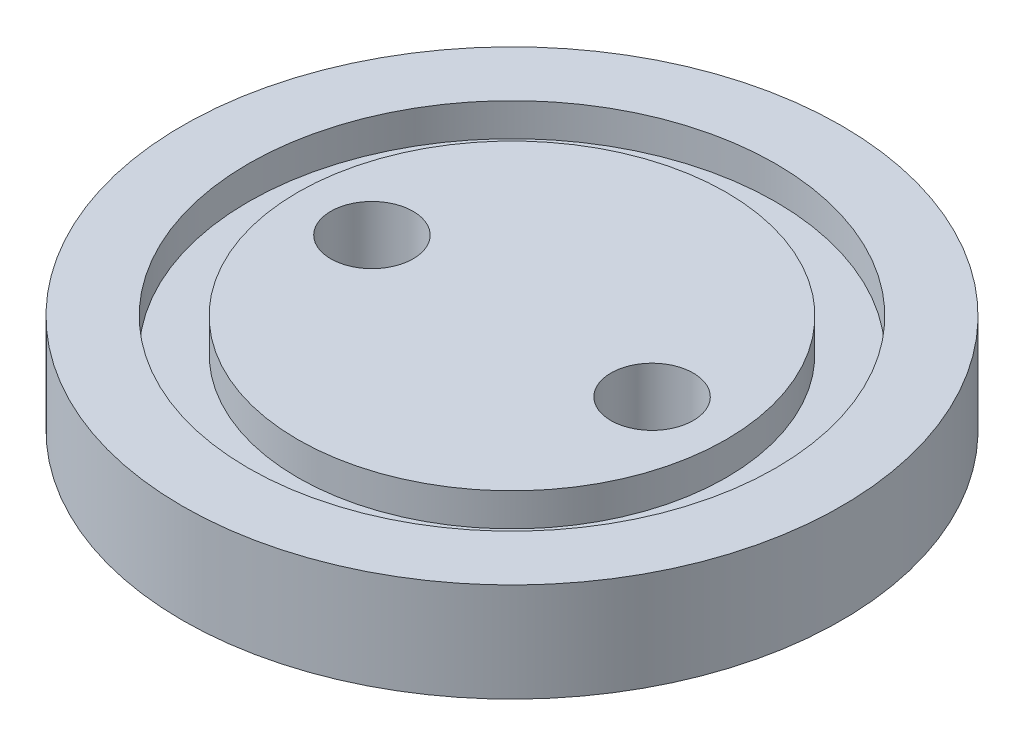
ISO-10303-21;
HEADER;
FILE_DESCRIPTION(('STEP AP214'),'2;1');
FILE_NAME('part.step','',(''),(''),'','','');
FILE_SCHEMA(('AUTOMOTIVE_DESIGN { 1 0 10303 214 1 1 1 1 }'));
ENDSEC;
DATA;
#1=APPLICATION_CONTEXT('core data for automotive mechanical design processes');
#2=APPLICATION_PROTOCOL_DEFINITION('international standard','automotive_design',2000,#1);
#3=PRODUCT_CONTEXT('',#1,'mechanical');
#4=PRODUCT('Part','Part','',(#3));
#5=PRODUCT_RELATED_PRODUCT_CATEGORY('part','',(#4));
#6=PRODUCT_DEFINITION_FORMATION('','',#4);
#7=PRODUCT_DEFINITION_CONTEXT('part definition',#1,'design');
#8=PRODUCT_DEFINITION('design','',#6,#7);
#9=PRODUCT_DEFINITION_SHAPE('','',#8);
#10=(LENGTH_UNIT() NAMED_UNIT(*) SI_UNIT(.MILLI.,.METRE.));
#11=(NAMED_UNIT(*) PLANE_ANGLE_UNIT() SI_UNIT($,.RADIAN.));
#12=(NAMED_UNIT(*) SI_UNIT($,.STERADIAN.) SOLID_ANGLE_UNIT());
#13=UNCERTAINTY_MEASURE_WITH_UNIT(LENGTH_MEASURE(1.E-05),#10,'distance_accuracy_value','');
#14=(GEOMETRIC_REPRESENTATION_CONTEXT(3) GLOBAL_UNCERTAINTY_ASSIGNED_CONTEXT((#13)) GLOBAL_UNIT_ASSIGNED_CONTEXT((#10,
#11,#12)) REPRESENTATION_CONTEXT('',''));
#15=CARTESIAN_POINT('',(0.,0.,0.));
#16=DIRECTION('',(0.,0.,1.));
#17=DIRECTION('',(1.,0.,0.));
#18=AXIS2_PLACEMENT_3D('',#15,#16,#17);
#19=CARTESIAN_POINT('',(0.,3.,0.));
#20=DIRECTION('',(0.,-1.,0.));
#21=DIRECTION('',(0.,0.,-1.));
#22=AXIS2_PLACEMENT_3D('',#19,#20,#21);
#23=CYLINDRICAL_SURFACE('',#22,10.);
#24=CARTESIAN_POINT('',(0.,3.,0.));
#25=DIRECTION('',(0.,1.,0.));
#26=DIRECTION('',(0.,0.,1.));
#27=AXIS2_PLACEMENT_3D('',#24,#25,#26);
#28=CIRCLE('',#27,10.);
#29=CARTESIAN_POINT('',(0.,3.,10.));
#30=VERTEX_POINT('',#29);
#31=EDGE_CURVE('E10',#30,#30,#28,.T.);
#32=ORIENTED_EDGE('',*,*,#31,.F.);
#33=EDGE_LOOP('',(#32));
#34=FACE_BOUND('',#33,.T.);
#35=CARTESIAN_POINT('',(0.,0.,0.));
#36=DIRECTION('',(0.,1.,0.));
#37=DIRECTION('',(0.,0.,1.));
#38=AXIS2_PLACEMENT_3D('',#35,#36,#37);
#39=CIRCLE('',#38,10.);
#40=CARTESIAN_POINT('',(0.,0.,10.));
#41=VERTEX_POINT('',#40);
#42=EDGE_CURVE('E45',#41,#41,#39,.T.);
#43=ORIENTED_EDGE('',*,*,#42,.T.);
#44=EDGE_LOOP('',(#43));
#45=FACE_BOUND('',#44,.T.);
#46=ADVANCED_FACE('F42',(#34,#45),#23,.T.);
#47=CARTESIAN_POINT('',(0.,3.,0.));
#48=DIRECTION('',(0.,1.,0.));
#49=DIRECTION('',(0.,0.,1.));
#50=AXIS2_PLACEMENT_3D('',#47,#48,#49);
#51=PLANE('',#50);
#52=CARTESIAN_POINT('',(0.,3.,0.));
#53=DIRECTION('',(0.,1.,0.));
#54=DIRECTION('',(0.,0.,1.));
#55=AXIS2_PLACEMENT_3D('',#52,#53,#54);
#56=CIRCLE('',#55,8.);
#57=CARTESIAN_POINT('',(0.,3.,8.));
#58=VERTEX_POINT('',#57);
#59=EDGE_CURVE('E56',#58,#58,#56,.T.);
#60=ORIENTED_EDGE('',*,*,#59,.F.);
#61=EDGE_LOOP('',(#60));
#62=FACE_BOUND('',#61,.T.);
#63=ORIENTED_EDGE('',*,*,#31,.T.);
#64=EDGE_LOOP('',(#63));
#65=FACE_BOUND('',#64,.T.);
#66=ADVANCED_FACE('F97',(#62,#65),#51,.T.);
#67=CARTESIAN_POINT('',(0.,0.,0.));
#68=DIRECTION('',(0.,1.,0.));
#69=DIRECTION('',(0.,0.,1.));
#70=AXIS2_PLACEMENT_3D('',#67,#68,#69);
#71=PLANE('',#70);
#72=CARTESIAN_POINT('',(4.25,0.,0.));
#73=DIRECTION('',(0.,1.,0.));
#74=DIRECTION('',(0.,0.,1.));
#75=AXIS2_PLACEMENT_3D('',#72,#73,#74);
#76=CIRCLE('',#75,1.25);
#77=CARTESIAN_POINT('',(4.25,0.,1.25));
#78=VERTEX_POINT('',#77);
#79=EDGE_CURVE('E80',#78,#78,#76,.T.);
#80=ORIENTED_EDGE('',*,*,#79,.T.);
#81=EDGE_LOOP('',(#80));
#82=FACE_BOUND('',#81,.T.);
#83=CARTESIAN_POINT('',(-4.25,0.,0.));
#84=DIRECTION('',(0.,1.,0.));
#85=DIRECTION('',(0.,0.,-1.));
#86=AXIS2_PLACEMENT_3D('',#83,#84,#85);
#87=CIRCLE('',#86,1.25);
#88=CARTESIAN_POINT('',(-4.25,0.,-1.25));
#89=VERTEX_POINT('',#88);
#90=EDGE_CURVE('E76',#89,#89,#87,.T.);
#91=ORIENTED_EDGE('',*,*,#90,.T.);
#92=EDGE_LOOP('',(#91));
#93=FACE_BOUND('',#92,.T.);
#94=ORIENTED_EDGE('',*,*,#42,.F.);
#95=EDGE_LOOP('',(#94));
#96=FACE_BOUND('',#95,.T.);
#97=ADVANCED_FACE('F119',(#82,#93,#96),#71,.F.);
#98=CARTESIAN_POINT('',(0.,2.,0.));
#99=DIRECTION('',(0.,1.,0.));
#100=DIRECTION('',(0.,0.,1.));
#101=AXIS2_PLACEMENT_3D('',#98,#99,#100);
#102=CYLINDRICAL_SURFACE('',#101,8.);
#103=CARTESIAN_POINT('',(0.,2.,0.));
#104=DIRECTION('',(0.,1.,0.));
#105=DIRECTION('',(0.,0.,1.));
#106=AXIS2_PLACEMENT_3D('',#103,#104,#105);
#107=CIRCLE('',#106,8.);
#108=CARTESIAN_POINT('',(0.,2.,8.));
#109=VERTEX_POINT('',#108);
#110=EDGE_CURVE('E54',#109,#109,#107,.T.);
#111=ORIENTED_EDGE('',*,*,#110,.F.);
#112=EDGE_LOOP('',(#111));
#113=FACE_BOUND('',#112,.T.);
#114=ORIENTED_EDGE('',*,*,#59,.T.);
#115=EDGE_LOOP('',(#114));
#116=FACE_BOUND('',#115,.T.);
#117=ADVANCED_FACE('F110',(#113,#116),#102,.F.);
#118=CARTESIAN_POINT('',(0.,2.,0.));
#119=DIRECTION('',(0.,1.,0.));
#120=DIRECTION('',(0.,0.,1.));
#121=AXIS2_PLACEMENT_3D('',#118,#119,#120);
#122=PLANE('',#121);
#123=CARTESIAN_POINT('',(0.,2.,0.));
#124=DIRECTION('',(0.,1.,0.));
#125=DIRECTION('',(0.,0.,1.));
#126=AXIS2_PLACEMENT_3D('',#123,#124,#125);
#127=CIRCLE('',#126,6.5);
#128=CARTESIAN_POINT('',(0.,2.,6.5));
#129=VERTEX_POINT('',#128);
#130=EDGE_CURVE('E60',#129,#129,#127,.T.);
#131=ORIENTED_EDGE('',*,*,#130,.F.);
#132=EDGE_LOOP('',(#131));
#133=FACE_BOUND('',#132,.T.);
#134=ORIENTED_EDGE('',*,*,#110,.T.);
#135=EDGE_LOOP('',(#134));
#136=FACE_BOUND('',#135,.T.);
#137=ADVANCED_FACE('F103',(#133,#136),#122,.T.);
#138=CARTESIAN_POINT('',(0.,2.,0.));
#139=DIRECTION('',(0.,1.,0.));
#140=DIRECTION('',(0.,0.,1.));
#141=AXIS2_PLACEMENT_3D('',#138,#139,#140);
#142=CYLINDRICAL_SURFACE('',#141,6.5);
#143=ORIENTED_EDGE('',*,*,#130,.T.);
#144=EDGE_LOOP('',(#143));
#145=FACE_BOUND('',#144,.T.);
#146=CARTESIAN_POINT('',(0.,3.,0.));
#147=DIRECTION('',(0.,1.,0.));
#148=DIRECTION('',(0.,0.,1.));
#149=AXIS2_PLACEMENT_3D('',#146,#147,#148);
#150=CIRCLE('',#149,6.5);
#151=CARTESIAN_POINT('',(0.,3.,6.5));
#152=VERTEX_POINT('',#151);
#153=EDGE_CURVE('E64',#152,#152,#150,.T.);
#154=ORIENTED_EDGE('',*,*,#153,.F.);
#155=EDGE_LOOP('',(#154));
#156=FACE_BOUND('',#155,.T.);
#157=ADVANCED_FACE('F95',(#145,#156),#142,.T.);
#158=CARTESIAN_POINT('',(4.25,3.,0.));
#159=DIRECTION('',(0.,1.,0.));
#160=DIRECTION('',(0.,0.,1.));
#161=AXIS2_PLACEMENT_3D('',#158,#159,#160);
#162=CIRCLE('',#161,1.25);
#163=CARTESIAN_POINT('',(4.25,3.,1.25));
#164=VERTEX_POINT('',#163);
#165=EDGE_CURVE('E68',#164,#164,#162,.T.);
#166=ORIENTED_EDGE('',*,*,#165,.F.);
#167=EDGE_LOOP('',(#166));
#168=FACE_BOUND('',#167,.T.);
#169=CARTESIAN_POINT('',(-4.25,3.,0.));
#170=DIRECTION('',(0.,1.,0.));
#171=DIRECTION('',(0.,0.,-1.));
#172=AXIS2_PLACEMENT_3D('',#169,#170,#171);
#173=CIRCLE('',#172,1.25);
#174=CARTESIAN_POINT('',(-4.25,3.,-1.25));
#175=VERTEX_POINT('',#174);
#176=EDGE_CURVE('E72',#175,#175,#173,.T.);
#177=ORIENTED_EDGE('',*,*,#176,.F.);
#178=EDGE_LOOP('',(#177));
#179=FACE_BOUND('',#178,.T.);
#180=ORIENTED_EDGE('',*,*,#153,.T.);
#181=EDGE_LOOP('',(#180));
#182=FACE_BOUND('',#181,.T.);
#183=ADVANCED_FACE('F91',(#168,#179,#182),#51,.T.);
#184=CARTESIAN_POINT('',(-4.25,3.,0.));
#185=DIRECTION('',(0.,-1.,0.));
#186=DIRECTION('',(0.,0.,-1.));
#187=AXIS2_PLACEMENT_3D('',#184,#185,#186);
#188=CYLINDRICAL_SURFACE('',#187,1.25);
#189=ORIENTED_EDGE('',*,*,#176,.T.);
#190=EDGE_LOOP('',(#189));
#191=FACE_BOUND('',#190,.T.);
#192=ORIENTED_EDGE('',*,*,#90,.F.);
#193=EDGE_LOOP('',(#192));
#194=FACE_BOUND('',#193,.T.);
#195=ADVANCED_FACE('F94',(#191,#194),#188,.F.);
#196=CARTESIAN_POINT('',(4.25,3.,0.));
#197=DIRECTION('',(0.,-1.,0.));
#198=DIRECTION('',(0.,0.,-1.));
#199=AXIS2_PLACEMENT_3D('',#196,#197,#198);
#200=CYLINDRICAL_SURFACE('',#199,1.25);
#201=ORIENTED_EDGE('',*,*,#165,.T.);
#202=EDGE_LOOP('',(#201));
#203=FACE_BOUND('',#202,.T.);
#204=ORIENTED_EDGE('',*,*,#79,.F.);
#205=EDGE_LOOP('',(#204));
#206=FACE_BOUND('',#205,.T.);
#207=ADVANCED_FACE('F88',(#203,#206),#200,.F.);
#208=CLOSED_SHELL('',(#46,#66,#97,#117,#137,#157,#183,#195,#207));
#209=MANIFOLD_SOLID_BREP('B2',#208);
#210=ADVANCED_BREP_SHAPE_REPRESENTATION('',(#18,#209),#14);
#211=SHAPE_DEFINITION_REPRESENTATION(#9,#210);
ENDSEC;
END-ISO-10303-21;
